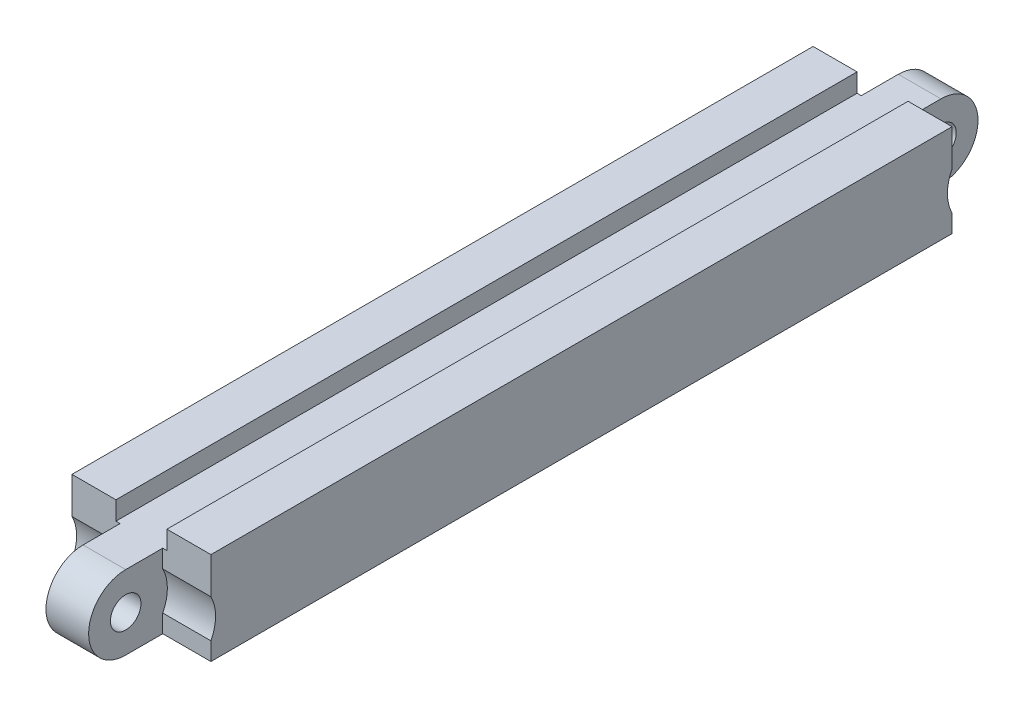
ISO-10303-21;
HEADER;
FILE_DESCRIPTION(('STEP AP214'),'2;1');
FILE_NAME('part.step','',(''),(''),'','','');
FILE_SCHEMA(('AUTOMOTIVE_DESIGN { 1 0 10303 214 1 1 1 1 }'));
ENDSEC;
DATA;
#1=APPLICATION_CONTEXT('core data for automotive mechanical design processes');
#2=APPLICATION_PROTOCOL_DEFINITION('international standard','automotive_design',2000,#1);
#3=PRODUCT_CONTEXT('',#1,'mechanical');
#4=PRODUCT('Part','Part','',(#3));
#5=PRODUCT_RELATED_PRODUCT_CATEGORY('part','',(#4));
#6=PRODUCT_DEFINITION_FORMATION('','',#4);
#7=PRODUCT_DEFINITION_CONTEXT('part definition',#1,'design');
#8=PRODUCT_DEFINITION('design','',#6,#7);
#9=PRODUCT_DEFINITION_SHAPE('','',#8);
#10=(LENGTH_UNIT() NAMED_UNIT(*) SI_UNIT(.MILLI.,.METRE.));
#11=(NAMED_UNIT(*) PLANE_ANGLE_UNIT() SI_UNIT($,.RADIAN.));
#12=(NAMED_UNIT(*) SI_UNIT($,.STERADIAN.) SOLID_ANGLE_UNIT());
#13=UNCERTAINTY_MEASURE_WITH_UNIT(LENGTH_MEASURE(1.E-05),#10,'distance_accuracy_value','');
#14=(GEOMETRIC_REPRESENTATION_CONTEXT(3) GLOBAL_UNCERTAINTY_ASSIGNED_CONTEXT((#13)) GLOBAL_UNIT_ASSIGNED_CONTEXT((#10,
#11,#12)) REPRESENTATION_CONTEXT('',''));
#15=CARTESIAN_POINT('',(0.,0.,0.));
#16=DIRECTION('',(0.,0.,1.));
#17=DIRECTION('',(1.,0.,0.));
#18=AXIS2_PLACEMENT_3D('',#15,#16,#17);
#19=CARTESIAN_POINT('',(7.5,0.,-40.));
#20=DIRECTION('',(0.,0.,-1.));
#21=DIRECTION('',(-1.,0.,0.));
#22=AXIS2_PLACEMENT_3D('',#19,#20,#21);
#23=PLANE('',#22);
#24=DIRECTION('',(0.,-1.,0.));
#25=VECTOR('',#24,1.);
#26=CARTESIAN_POINT('',(2.3,0.,-40.));
#27=LINE('',#26,#25);
#28=CARTESIAN_POINT('',(2.3,-2.06155281280881,-40.));
#29=VERTEX_POINT('',#28);
#30=CARTESIAN_POINT('',(2.3,-4.,-40.));
#31=VERTEX_POINT('',#30);
#32=EDGE_CURVE('E46',#29,#31,#27,.T.);
#33=ORIENTED_EDGE('',*,*,#32,.F.);
#34=DIRECTION('',(-1.,0.,0.));
#35=VECTOR('',#34,1.);
#36=CARTESIAN_POINT('',(7.5,-2.06155281280881,-40.));
#37=LINE('',#36,#35);
#38=CARTESIAN_POINT('',(7.5,-2.06155281280881,-40.));
#39=VERTEX_POINT('',#38);
#40=EDGE_CURVE('E353',#29,#39,#37,.F.);
#41=ORIENTED_EDGE('',*,*,#40,.T.);
#42=DIRECTION('',(0.,-1.,0.));
#43=VECTOR('',#42,1.);
#44=CARTESIAN_POINT('',(7.5,0.,-40.));
#45=LINE('',#44,#43);
#46=CARTESIAN_POINT('',(7.5,-4.,-40.));
#47=VERTEX_POINT('',#46);
#48=EDGE_CURVE('E61',#39,#47,#45,.T.);
#49=ORIENTED_EDGE('',*,*,#48,.T.);
#50=DIRECTION('',(-1.,0.,0.));
#51=VECTOR('',#50,1.);
#52=CARTESIAN_POINT('',(7.5,-4.,-40.));
#53=LINE('',#52,#51);
#54=EDGE_CURVE('E390',#47,#31,#53,.T.);
#55=ORIENTED_EDGE('',*,*,#54,.T.);
#56=EDGE_LOOP('',(#33,#41,#49,#55));
#57=FACE_BOUND('',#56,.T.);
#58=ADVANCED_FACE('F38',(#57),#23,.T.);
#59=CARTESIAN_POINT('',(7.5,6.,-40.));
#60=VERTEX_POINT('',#59);
#61=CARTESIAN_POINT('',(7.5,2.06155281280883,-40.));
#62=VERTEX_POINT('',#61);
#63=EDGE_CURVE('E385',#60,#62,#45,.T.);
#64=ORIENTED_EDGE('',*,*,#63,.T.);
#65=DIRECTION('',(-1.,0.,0.));
#66=VECTOR('',#65,1.);
#67=CARTESIAN_POINT('',(7.5,2.06155281280883,-40.));
#68=LINE('',#67,#66);
#69=CARTESIAN_POINT('',(2.3,2.06155281280883,-40.));
#70=VERTEX_POINT('',#69);
#71=EDGE_CURVE('E53',#62,#70,#68,.T.);
#72=ORIENTED_EDGE('',*,*,#71,.T.);
#73=CARTESIAN_POINT('',(2.3,4.,-40.));
#74=VERTEX_POINT('',#73);
#75=EDGE_CURVE('E11',#74,#70,#27,.T.);
#76=ORIENTED_EDGE('',*,*,#75,.F.);
#77=DIRECTION('',(-1.,0.,0.));
#78=VECTOR('',#77,1.);
#79=CARTESIAN_POINT('',(7.5,4.,-40.));
#80=LINE('',#79,#78);
#81=CARTESIAN_POINT('',(2.75,4.,-40.));
#82=VERTEX_POINT('',#81);
#83=EDGE_CURVE('E388',#82,#74,#80,.T.);
#84=ORIENTED_EDGE('',*,*,#83,.F.);
#85=DIRECTION('',(0.,-1.,0.));
#86=VECTOR('',#85,1.);
#87=CARTESIAN_POINT('',(2.75,0.,-40.));
#88=LINE('',#87,#86);
#89=CARTESIAN_POINT('',(2.75,6.,-40.));
#90=VERTEX_POINT('',#89);
#91=EDGE_CURVE('E369',#90,#82,#88,.T.);
#92=ORIENTED_EDGE('',*,*,#91,.F.);
#93=DIRECTION('',(-1.,0.,0.));
#94=VECTOR('',#93,1.);
#95=CARTESIAN_POINT('',(48.7310562561766,6.,-40.));
#96=LINE('',#95,#94);
#97=EDGE_CURVE('E378',#60,#90,#96,.T.);
#98=ORIENTED_EDGE('',*,*,#97,.F.);
#99=EDGE_LOOP('',(#64,#72,#76,#84,#92,#98));
#100=FACE_BOUND('',#99,.T.);
#101=ADVANCED_FACE('F415',(#100),#23,.T.);
#102=CARTESIAN_POINT('',(7.5,4.,0.));
#103=DIRECTION('',(0.,1.,0.));
#104=DIRECTION('',(0.,0.,1.));
#105=AXIS2_PLACEMENT_3D('',#102,#103,#104);
#106=PLANE('',#105);
#107=DIRECTION('',(-1.,0.,0.));
#108=VECTOR('',#107,1.);
#109=CARTESIAN_POINT('',(2.3,4.00000000000001,-44.));
#110=LINE('',#109,#108);
#111=CARTESIAN_POINT('',(2.3,4.00000000000001,-44.));
#112=VERTEX_POINT('',#111);
#113=CARTESIAN_POINT('',(-2.3,4.00000000000001,-44.));
#114=VERTEX_POINT('',#113);
#115=EDGE_CURVE('E365',#112,#114,#110,.T.);
#116=ORIENTED_EDGE('',*,*,#115,.T.);
#117=DIRECTION('',(0.,0.,1.));
#118=VECTOR('',#117,1.);
#119=CARTESIAN_POINT('',(-2.3,3.99999999999993,0.));
#120=LINE('',#119,#118);
#121=CARTESIAN_POINT('',(-2.3,4.,-40.));
#122=VERTEX_POINT('',#121);
#123=EDGE_CURVE('E318',#114,#122,#120,.T.);
#124=ORIENTED_EDGE('',*,*,#123,.T.);
#125=DIRECTION('',(1.,0.,0.));
#126=VECTOR('',#125,1.);
#127=CARTESIAN_POINT('',(-7.5,4.,-40.));
#128=LINE('',#127,#126);
#129=CARTESIAN_POINT('',(-2.75,4.,-40.));
#130=VERTEX_POINT('',#129);
#131=EDGE_CURVE('E337',#130,#122,#128,.T.);
#132=ORIENTED_EDGE('',*,*,#131,.F.);
#133=DIRECTION('',(0.,0.,-1.));
#134=VECTOR('',#133,1.);
#135=CARTESIAN_POINT('',(-2.75,4.,0.));
#136=LINE('',#135,#134);
#137=CARTESIAN_POINT('',(-2.75,4.,40.));
#138=VERTEX_POINT('',#137);
#139=EDGE_CURVE('E330',#138,#130,#136,.T.);
#140=ORIENTED_EDGE('',*,*,#139,.F.);
#141=DIRECTION('',(1.,0.,0.));
#142=VECTOR('',#141,1.);
#143=CARTESIAN_POINT('',(-7.5,4.,40.));
#144=LINE('',#143,#142);
#145=CARTESIAN_POINT('',(-2.3,4.,40.));
#146=VERTEX_POINT('',#145);
#147=EDGE_CURVE('E247',#138,#146,#144,.T.);
#148=ORIENTED_EDGE('',*,*,#147,.T.);
#149=DIRECTION('',(0.,0.,-1.));
#150=VECTOR('',#149,1.);
#151=CARTESIAN_POINT('',(-2.3,3.99999999999993,0.));
#152=LINE('',#151,#150);
#153=CARTESIAN_POINT('',(-2.3,4.00000000000001,44.));
#154=VERTEX_POINT('',#153);
#155=EDGE_CURVE('E239',#154,#146,#152,.T.);
#156=ORIENTED_EDGE('',*,*,#155,.F.);
#157=DIRECTION('',(-1.,0.,0.));
#158=VECTOR('',#157,1.);
#159=CARTESIAN_POINT('',(2.3,4.00000000000001,44.));
#160=LINE('',#159,#158);
#161=CARTESIAN_POINT('',(2.3,4.00000000000001,44.));
#162=VERTEX_POINT('',#161);
#163=EDGE_CURVE('E274',#162,#154,#160,.T.);
#164=ORIENTED_EDGE('',*,*,#163,.F.);
#165=DIRECTION('',(0.,0.,-1.));
#166=VECTOR('',#165,1.);
#167=CARTESIAN_POINT('',(2.3,3.99999999999993,0.));
#168=LINE('',#167,#166);
#169=CARTESIAN_POINT('',(2.3,4.,40.));
#170=VERTEX_POINT('',#169);
#171=EDGE_CURVE('E272',#162,#170,#168,.T.);
#172=ORIENTED_EDGE('',*,*,#171,.T.);
#173=DIRECTION('',(-1.,0.,0.));
#174=VECTOR('',#173,1.);
#175=CARTESIAN_POINT('',(7.5,4.,40.));
#176=LINE('',#175,#174);
#177=CARTESIAN_POINT('',(2.75,4.,40.));
#178=VERTEX_POINT('',#177);
#179=EDGE_CURVE('E290',#178,#170,#176,.T.);
#180=ORIENTED_EDGE('',*,*,#179,.F.);
#181=DIRECTION('',(0.,0.,-1.));
#182=VECTOR('',#181,1.);
#183=CARTESIAN_POINT('',(2.75,4.,0.));
#184=LINE('',#183,#182);
#185=EDGE_CURVE('E380',#178,#82,#184,.T.);
#186=ORIENTED_EDGE('',*,*,#185,.T.);
#187=ORIENTED_EDGE('',*,*,#83,.T.);
#188=DIRECTION('',(0.,0.,1.));
#189=VECTOR('',#188,1.);
#190=CARTESIAN_POINT('',(2.3,3.99999999999993,0.));
#191=LINE('',#190,#189);
#192=EDGE_CURVE('E363',#112,#74,#191,.T.);
#193=ORIENTED_EDGE('',*,*,#192,.F.);
#194=EDGE_LOOP('',(#116,#124,#132,#140,#148,#156,#164,#172,#180,#186,#187,#193));
#195=FACE_BOUND('',#194,.T.);
#196=ADVANCED_FACE('F417',(#195),#106,.T.);
#197=CARTESIAN_POINT('',(7.5,-4.,0.));
#198=DIRECTION('',(0.,-1.,0.));
#199=DIRECTION('',(0.,0.,-1.));
#200=AXIS2_PLACEMENT_3D('',#197,#198,#199);
#201=PLANE('',#200);
#202=DIRECTION('',(0.,0.,1.));
#203=VECTOR('',#202,1.);
#204=CARTESIAN_POINT('',(7.5,-4.,0.));
#205=LINE('',#204,#203);
#206=CARTESIAN_POINT('',(7.5,-4.,40.));
#207=VERTEX_POINT('',#206);
#208=EDGE_CURVE('E383',#47,#207,#205,.T.);
#209=ORIENTED_EDGE('',*,*,#208,.T.);
#210=DIRECTION('',(-1.,0.,0.));
#211=VECTOR('',#210,1.);
#212=CARTESIAN_POINT('',(7.5,-4.,40.));
#213=LINE('',#212,#211);
#214=CARTESIAN_POINT('',(2.3,-4.,40.));
#215=VERTEX_POINT('',#214);
#216=EDGE_CURVE('E293',#207,#215,#213,.T.);
#217=ORIENTED_EDGE('',*,*,#216,.T.);
#218=DIRECTION('',(0.,0.,-1.));
#219=VECTOR('',#218,1.);
#220=CARTESIAN_POINT('',(2.3,-4.00000000000007,0.));
#221=LINE('',#220,#219);
#222=CARTESIAN_POINT('',(2.3,-3.99999999999999,44.));
#223=VERTEX_POINT('',#222);
#224=EDGE_CURVE('E268',#223,#215,#221,.T.);
#225=ORIENTED_EDGE('',*,*,#224,.F.);
#226=DIRECTION('',(-1.,0.,0.));
#227=VECTOR('',#226,1.);
#228=CARTESIAN_POINT('',(2.3,-3.99999999999999,44.));
#229=LINE('',#228,#227);
#230=CARTESIAN_POINT('',(-2.3,-3.99999999999999,44.));
#231=VERTEX_POINT('',#230);
#232=EDGE_CURVE('E277',#223,#231,#229,.T.);
#233=ORIENTED_EDGE('',*,*,#232,.T.);
#234=DIRECTION('',(0.,0.,-1.));
#235=VECTOR('',#234,1.);
#236=CARTESIAN_POINT('',(-2.3,-4.00000000000007,0.));
#237=LINE('',#236,#235);
#238=CARTESIAN_POINT('',(-2.3,-4.,40.));
#239=VERTEX_POINT('',#238);
#240=EDGE_CURVE('E230',#231,#239,#237,.T.);
#241=ORIENTED_EDGE('',*,*,#240,.T.);
#242=DIRECTION('',(1.,0.,0.));
#243=VECTOR('',#242,1.);
#244=CARTESIAN_POINT('',(-7.5,-4.,40.));
#245=LINE('',#244,#243);
#246=CARTESIAN_POINT('',(-7.5,-4.,40.));
#247=VERTEX_POINT('',#246);
#248=EDGE_CURVE('E250',#247,#239,#245,.T.);
#249=ORIENTED_EDGE('',*,*,#248,.F.);
#250=DIRECTION('',(0.,0.,1.));
#251=VECTOR('',#250,1.);
#252=CARTESIAN_POINT('',(-7.5,-4.,0.));
#253=LINE('',#252,#251);
#254=CARTESIAN_POINT('',(-7.5,-4.,-40.));
#255=VERTEX_POINT('',#254);
#256=EDGE_CURVE('E218',#255,#247,#253,.T.);
#257=ORIENTED_EDGE('',*,*,#256,.F.);
#258=DIRECTION('',(1.,0.,0.));
#259=VECTOR('',#258,1.);
#260=CARTESIAN_POINT('',(-7.5,-4.,-40.));
#261=LINE('',#260,#259);
#262=CARTESIAN_POINT('',(-2.3,-4.,-40.));
#263=VERTEX_POINT('',#262);
#264=EDGE_CURVE('E340',#255,#263,#261,.T.);
#265=ORIENTED_EDGE('',*,*,#264,.T.);
#266=DIRECTION('',(0.,0.,1.));
#267=VECTOR('',#266,1.);
#268=CARTESIAN_POINT('',(-2.3,-4.00000000000007,0.));
#269=LINE('',#268,#267);
#270=CARTESIAN_POINT('',(-2.3,-3.99999999999999,-44.));
#271=VERTEX_POINT('',#270);
#272=EDGE_CURVE('E313',#271,#263,#269,.T.);
#273=ORIENTED_EDGE('',*,*,#272,.F.);
#274=DIRECTION('',(-1.,0.,0.));
#275=VECTOR('',#274,1.);
#276=CARTESIAN_POINT('',(2.3,-3.99999999999999,-44.));
#277=LINE('',#276,#275);
#278=CARTESIAN_POINT('',(2.3,-3.99999999999999,-44.));
#279=VERTEX_POINT('',#278);
#280=EDGE_CURVE('E367',#279,#271,#277,.T.);
#281=ORIENTED_EDGE('',*,*,#280,.F.);
#282=DIRECTION('',(0.,0.,1.));
#283=VECTOR('',#282,1.);
#284=CARTESIAN_POINT('',(2.3,-4.00000000000007,0.));
#285=LINE('',#284,#283);
#286=EDGE_CURVE('E358',#279,#31,#285,.T.);
#287=ORIENTED_EDGE('',*,*,#286,.T.);
#288=ORIENTED_EDGE('',*,*,#54,.F.);
#289=EDGE_LOOP('',(#209,#217,#225,#233,#241,#249,#257,#265,#273,#281,#287,#288));
#290=FACE_BOUND('',#289,.T.);
#291=ADVANCED_FACE('F40',(#290),#201,.T.);
#292=CARTESIAN_POINT('',(7.5,0.,0.));
#293=DIRECTION('',(1.,0.,0.));
#294=DIRECTION('',(0.,0.,-1.));
#295=AXIS2_PLACEMENT_3D('',#292,#293,#294);
#296=PLANE('',#295);
#297=ORIENTED_EDGE('',*,*,#48,.F.);
#298=CARTESIAN_POINT('',(7.5,0.,-44.));
#299=DIRECTION('',(1.,0.,0.));
#300=DIRECTION('',(0.,0.,-1.));
#301=AXIS2_PLACEMENT_3D('',#298,#299,#300);
#302=CIRCLE('',#301,4.5);
#303=EDGE_CURVE('E348',#62,#39,#302,.T.);
#304=ORIENTED_EDGE('',*,*,#303,.F.);
#305=ORIENTED_EDGE('',*,*,#63,.F.);
#306=DIRECTION('',(0.,0.,-1.));
#307=VECTOR('',#306,1.);
#308=CARTESIAN_POINT('',(7.5,6.,0.));
#309=LINE('',#308,#307);
#310=CARTESIAN_POINT('',(7.5,6.,40.));
#311=VERTEX_POINT('',#310);
#312=EDGE_CURVE('E373',#311,#60,#309,.T.);
#313=ORIENTED_EDGE('',*,*,#312,.F.);
#314=DIRECTION('',(0.,-1.,0.));
#315=VECTOR('',#314,1.);
#316=CARTESIAN_POINT('',(7.5,0.,40.));
#317=LINE('',#316,#315);
#318=CARTESIAN_POINT('',(7.5,2.06155281280883,40.));
#319=VERTEX_POINT('',#318);
#320=EDGE_CURVE('E287',#311,#319,#317,.T.);
#321=ORIENTED_EDGE('',*,*,#320,.T.);
#322=CARTESIAN_POINT('',(7.5,0.,44.));
#323=DIRECTION('',(-1.,0.,0.));
#324=DIRECTION('',(0.,0.,1.));
#325=AXIS2_PLACEMENT_3D('',#322,#323,#324);
#326=CIRCLE('',#325,4.5);
#327=CARTESIAN_POINT('',(7.5,-2.06155281280881,40.));
#328=VERTEX_POINT('',#327);
#329=EDGE_CURVE('E256',#319,#328,#326,.T.);
#330=ORIENTED_EDGE('',*,*,#329,.T.);
#331=EDGE_CURVE('E286',#328,#207,#317,.T.);
#332=ORIENTED_EDGE('',*,*,#331,.T.);
#333=ORIENTED_EDGE('',*,*,#208,.F.);
#334=EDGE_LOOP('',(#297,#304,#305,#313,#321,#330,#332,#333));
#335=FACE_BOUND('',#334,.T.);
#336=ADVANCED_FACE('F399',(#335),#296,.T.);
#337=CARTESIAN_POINT('',(2.75,0.,0.));
#338=DIRECTION('',(1.,0.,0.));
#339=DIRECTION('',(0.,0.,-1.));
#340=AXIS2_PLACEMENT_3D('',#337,#338,#339);
#341=PLANE('',#340);
#342=ORIENTED_EDGE('',*,*,#185,.F.);
#343=DIRECTION('',(0.,-1.,0.));
#344=VECTOR('',#343,1.);
#345=CARTESIAN_POINT('',(2.75,0.,40.));
#346=LINE('',#345,#344);
#347=CARTESIAN_POINT('',(2.75,6.,40.));
#348=VERTEX_POINT('',#347);
#349=EDGE_CURVE('E280',#348,#178,#346,.T.);
#350=ORIENTED_EDGE('',*,*,#349,.F.);
#351=DIRECTION('',(0.,0.,-1.));
#352=VECTOR('',#351,1.);
#353=CARTESIAN_POINT('',(2.75,6.,0.));
#354=LINE('',#353,#352);
#355=EDGE_CURVE('E370',#348,#90,#354,.T.);
#356=ORIENTED_EDGE('',*,*,#355,.T.);
#357=ORIENTED_EDGE('',*,*,#91,.T.);
#358=EDGE_LOOP('',(#342,#350,#356,#357));
#359=FACE_BOUND('',#358,.T.);
#360=ADVANCED_FACE('F421',(#359),#341,.F.);
#361=CARTESIAN_POINT('',(48.7310562561766,6.,0.));
#362=DIRECTION('',(0.,1.,0.));
#363=DIRECTION('',(0.,0.,1.));
#364=AXIS2_PLACEMENT_3D('',#361,#362,#363);
#365=PLANE('',#364);
#366=ORIENTED_EDGE('',*,*,#355,.F.);
#367=DIRECTION('',(-1.,0.,0.));
#368=VECTOR('',#367,1.);
#369=CARTESIAN_POINT('',(48.7310562561766,6.,40.));
#370=LINE('',#369,#368);
#371=EDGE_CURVE('E283',#311,#348,#370,.T.);
#372=ORIENTED_EDGE('',*,*,#371,.F.);
#373=ORIENTED_EDGE('',*,*,#312,.T.);
#374=ORIENTED_EDGE('',*,*,#97,.T.);
#375=EDGE_LOOP('',(#366,#372,#373,#374));
#376=FACE_BOUND('',#375,.T.);
#377=ADVANCED_FACE('F425',(#376),#365,.T.);
#378=CARTESIAN_POINT('',(2.3,0.,-44.));
#379=DIRECTION('',(-1.,0.,0.));
#380=DIRECTION('',(0.,0.,1.));
#381=AXIS2_PLACEMENT_3D('',#378,#379,#380);
#382=CYLINDRICAL_SURFACE('',#381,4.);
#383=ORIENTED_EDGE('',*,*,#280,.T.);
#384=CARTESIAN_POINT('',(-2.3,0.,-44.));
#385=DIRECTION('',(1.,0.,0.));
#386=DIRECTION('',(0.,0.,-1.));
#387=AXIS2_PLACEMENT_3D('',#384,#385,#386);
#388=CIRCLE('',#387,4.);
#389=EDGE_CURVE('E315',#271,#114,#388,.T.);
#390=ORIENTED_EDGE('',*,*,#389,.T.);
#391=ORIENTED_EDGE('',*,*,#115,.F.);
#392=CARTESIAN_POINT('',(2.3,0.,-44.));
#393=DIRECTION('',(1.,0.,0.));
#394=DIRECTION('',(0.,0.,-1.));
#395=AXIS2_PLACEMENT_3D('',#392,#393,#394);
#396=CIRCLE('',#395,4.);
#397=EDGE_CURVE('E360',#279,#112,#396,.T.);
#398=ORIENTED_EDGE('',*,*,#397,.F.);
#399=EDGE_LOOP('',(#383,#390,#391,#398));
#400=FACE_BOUND('',#399,.T.);
#401=ADVANCED_FACE('F411',(#400),#382,.T.);
#402=CARTESIAN_POINT('',(2.3,0.,-44.));
#403=DIRECTION('',(-1.,0.,0.));
#404=DIRECTION('',(0.,0.,1.));
#405=AXIS2_PLACEMENT_3D('',#402,#403,#404);
#406=CYLINDRICAL_SURFACE('',#405,1.65);
#407=CARTESIAN_POINT('',(2.3,0.,-44.));
#408=DIRECTION('',(1.,0.,0.));
#409=DIRECTION('',(0.,0.,-1.));
#410=AXIS2_PLACEMENT_3D('',#407,#408,#409);
#411=CIRCLE('',#410,1.65);
#412=CARTESIAN_POINT('',(2.3,0.,-45.65));
#413=VERTEX_POINT('',#412);
#414=EDGE_CURVE('E355',#413,#413,#411,.T.);
#415=ORIENTED_EDGE('',*,*,#414,.T.);
#416=EDGE_LOOP('',(#415));
#417=FACE_BOUND('',#416,.T.);
#418=CARTESIAN_POINT('',(-2.3,0.,-44.));
#419=DIRECTION('',(1.,0.,0.));
#420=DIRECTION('',(0.,0.,-1.));
#421=AXIS2_PLACEMENT_3D('',#418,#419,#420);
#422=CIRCLE('',#421,1.65);
#423=CARTESIAN_POINT('',(-2.3,0.,-45.65));
#424=VERTEX_POINT('',#423);
#425=EDGE_CURVE('E310',#424,#424,#422,.T.);
#426=ORIENTED_EDGE('',*,*,#425,.F.);
#427=EDGE_LOOP('',(#426));
#428=FACE_BOUND('',#427,.T.);
#429=ADVANCED_FACE('F501',(#417,#428),#406,.F.);
#430=CARTESIAN_POINT('',(2.3,0.,0.));
#431=DIRECTION('',(1.,0.,0.));
#432=DIRECTION('',(0.,0.,-1.));
#433=AXIS2_PLACEMENT_3D('',#430,#431,#432);
#434=PLANE('',#433);
#435=ORIENTED_EDGE('',*,*,#75,.T.);
#436=CARTESIAN_POINT('',(2.3,0.,-44.));
#437=DIRECTION('',(1.,0.,0.));
#438=DIRECTION('',(0.,0.,-1.));
#439=AXIS2_PLACEMENT_3D('',#436,#437,#438);
#440=CIRCLE('',#439,4.5);
#441=EDGE_CURVE('E347',#70,#29,#440,.T.);
#442=ORIENTED_EDGE('',*,*,#441,.T.);
#443=ORIENTED_EDGE('',*,*,#32,.T.);
#444=ORIENTED_EDGE('',*,*,#286,.F.);
#445=ORIENTED_EDGE('',*,*,#397,.T.);
#446=ORIENTED_EDGE('',*,*,#192,.T.);
#447=EDGE_LOOP('',(#435,#442,#443,#444,#445,#446));
#448=FACE_BOUND('',#447,.T.);
#449=ORIENTED_EDGE('',*,*,#414,.F.);
#450=EDGE_LOOP('',(#449));
#451=FACE_BOUND('',#450,.T.);
#452=ADVANCED_FACE('F395',(#448,#451),#434,.T.);
#453=CARTESIAN_POINT('',(7.5,0.,-44.));
#454=DIRECTION('',(-1.,0.,0.));
#455=DIRECTION('',(0.,0.,1.));
#456=AXIS2_PLACEMENT_3D('',#453,#454,#455);
#457=CYLINDRICAL_SURFACE('',#456,4.5);
#458=ORIENTED_EDGE('',*,*,#441,.F.);
#459=ORIENTED_EDGE('',*,*,#71,.F.);
#460=ORIENTED_EDGE('',*,*,#303,.T.);
#461=ORIENTED_EDGE('',*,*,#40,.F.);
#462=EDGE_LOOP('',(#458,#459,#460,#461));
#463=FACE_BOUND('',#462,.T.);
#464=ADVANCED_FACE('F509',(#463),#457,.F.);
#465=CARTESIAN_POINT('',(-7.5,0.,-40.));
#466=DIRECTION('',(0.,0.,-1.));
#467=DIRECTION('',(1.,0.,0.));
#468=AXIS2_PLACEMENT_3D('',#465,#466,#467);
#469=PLANE('',#468);
#470=DIRECTION('',(0.,-1.,0.));
#471=VECTOR('',#470,1.);
#472=CARTESIAN_POINT('',(-2.3,0.,-40.));
#473=LINE('',#472,#471);
#474=CARTESIAN_POINT('',(-2.3,-2.06155281280881,-40.));
#475=VERTEX_POINT('',#474);
#476=EDGE_CURVE('E343',#475,#263,#473,.T.);
#477=ORIENTED_EDGE('',*,*,#476,.T.);
#478=ORIENTED_EDGE('',*,*,#264,.F.);
#479=DIRECTION('',(0.,-1.,0.));
#480=VECTOR('',#479,1.);
#481=CARTESIAN_POINT('',(-7.5,0.,-40.));
#482=LINE('',#481,#480);
#483=CARTESIAN_POINT('',(-7.5,-2.06155281280881,-40.));
#484=VERTEX_POINT('',#483);
#485=EDGE_CURVE('E333',#484,#255,#482,.T.);
#486=ORIENTED_EDGE('',*,*,#485,.F.);
#487=DIRECTION('',(1.,0.,0.));
#488=VECTOR('',#487,1.);
#489=CARTESIAN_POINT('',(-7.5,-2.06155281280881,-40.));
#490=LINE('',#489,#488);
#491=EDGE_CURVE('E307',#475,#484,#490,.F.);
#492=ORIENTED_EDGE('',*,*,#491,.F.);
#493=EDGE_LOOP('',(#477,#478,#486,#492));
#494=FACE_BOUND('',#493,.T.);
#495=ADVANCED_FACE('F455',(#494),#469,.T.);
#496=CARTESIAN_POINT('',(-7.5,6.,-40.));
#497=VERTEX_POINT('',#496);
#498=CARTESIAN_POINT('',(-7.5,2.06155281280883,-40.));
#499=VERTEX_POINT('',#498);
#500=EDGE_CURVE('E334',#497,#499,#482,.T.);
#501=ORIENTED_EDGE('',*,*,#500,.F.);
#502=DIRECTION('',(1.,0.,0.));
#503=VECTOR('',#502,1.);
#504=CARTESIAN_POINT('',(-48.7310562561766,6.,-40.));
#505=LINE('',#504,#503);
#506=CARTESIAN_POINT('',(-2.75,6.,-40.));
#507=VERTEX_POINT('',#506);
#508=EDGE_CURVE('E327',#497,#507,#505,.T.);
#509=ORIENTED_EDGE('',*,*,#508,.T.);
#510=DIRECTION('',(0.,-1.,0.));
#511=VECTOR('',#510,1.);
#512=CARTESIAN_POINT('',(-2.75,0.,-40.));
#513=LINE('',#512,#511);
#514=EDGE_CURVE('E320',#507,#130,#513,.T.);
#515=ORIENTED_EDGE('',*,*,#514,.T.);
#516=ORIENTED_EDGE('',*,*,#131,.T.);
#517=CARTESIAN_POINT('',(-2.3,2.06155281280883,-40.));
#518=VERTEX_POINT('',#517);
#519=EDGE_CURVE('E344',#122,#518,#473,.T.);
#520=ORIENTED_EDGE('',*,*,#519,.T.);
#521=DIRECTION('',(1.,0.,0.));
#522=VECTOR('',#521,1.);
#523=CARTESIAN_POINT('',(-7.5,2.06155281280883,-40.));
#524=LINE('',#523,#522);
#525=EDGE_CURVE('E303',#499,#518,#524,.T.);
#526=ORIENTED_EDGE('',*,*,#525,.F.);
#527=EDGE_LOOP('',(#501,#509,#515,#516,#520,#526));
#528=FACE_BOUND('',#527,.T.);
#529=ADVANCED_FACE('F466',(#528),#469,.T.);
#530=CARTESIAN_POINT('',(-7.5,0.,0.));
#531=DIRECTION('',(-1.,0.,0.));
#532=DIRECTION('',(0.,0.,-1.));
#533=AXIS2_PLACEMENT_3D('',#530,#531,#532);
#534=PLANE('',#533);
#535=ORIENTED_EDGE('',*,*,#485,.T.);
#536=ORIENTED_EDGE('',*,*,#256,.T.);
#537=DIRECTION('',(0.,-1.,0.));
#538=VECTOR('',#537,1.);
#539=CARTESIAN_POINT('',(-7.5,0.,40.));
#540=LINE('',#539,#538);
#541=CARTESIAN_POINT('',(-7.5,-2.06155281280881,40.));
#542=VERTEX_POINT('',#541);
#543=EDGE_CURVE('E215',#542,#247,#540,.T.);
#544=ORIENTED_EDGE('',*,*,#543,.F.);
#545=CARTESIAN_POINT('',(-7.5,0.,44.));
#546=DIRECTION('',(-1.,0.,0.));
#547=DIRECTION('',(0.,0.,1.));
#548=AXIS2_PLACEMENT_3D('',#545,#546,#547);
#549=CIRCLE('',#548,4.5);
#550=CARTESIAN_POINT('',(-7.5,2.06155281280883,40.));
#551=VERTEX_POINT('',#550);
#552=EDGE_CURVE('E201',#551,#542,#549,.T.);
#553=ORIENTED_EDGE('',*,*,#552,.F.);
#554=CARTESIAN_POINT('',(-7.5,6.,40.));
#555=VERTEX_POINT('',#554);
#556=EDGE_CURVE('E222',#555,#551,#540,.T.);
#557=ORIENTED_EDGE('',*,*,#556,.F.);
#558=DIRECTION('',(0.,0.,-1.));
#559=VECTOR('',#558,1.);
#560=CARTESIAN_POINT('',(-7.5,6.,0.));
#561=LINE('',#560,#559);
#562=EDGE_CURVE('E323',#555,#497,#561,.T.);
#563=ORIENTED_EDGE('',*,*,#562,.T.);
#564=ORIENTED_EDGE('',*,*,#500,.T.);
#565=CARTESIAN_POINT('',(-7.5,0.,-44.));
#566=DIRECTION('',(1.,0.,0.));
#567=DIRECTION('',(0.,0.,-1.));
#568=AXIS2_PLACEMENT_3D('',#565,#566,#567);
#569=CIRCLE('',#568,4.5);
#570=EDGE_CURVE('E301',#499,#484,#569,.T.);
#571=ORIENTED_EDGE('',*,*,#570,.T.);
#572=EDGE_LOOP('',(#535,#536,#544,#553,#557,#563,#564,#571));
#573=FACE_BOUND('',#572,.T.);
#574=ADVANCED_FACE('F217',(#573),#534,.T.);
#575=CARTESIAN_POINT('',(-2.75,0.,0.));
#576=DIRECTION('',(-1.,0.,0.));
#577=DIRECTION('',(0.,0.,-1.));
#578=AXIS2_PLACEMENT_3D('',#575,#576,#577);
#579=PLANE('',#578);
#580=ORIENTED_EDGE('',*,*,#139,.T.);
#581=ORIENTED_EDGE('',*,*,#514,.F.);
#582=DIRECTION('',(0.,0.,-1.));
#583=VECTOR('',#582,1.);
#584=CARTESIAN_POINT('',(-2.75,6.,0.));
#585=LINE('',#584,#583);
#586=CARTESIAN_POINT('',(-2.75,6.,40.));
#587=VERTEX_POINT('',#586);
#588=EDGE_CURVE('E321',#587,#507,#585,.T.);
#589=ORIENTED_EDGE('',*,*,#588,.F.);
#590=DIRECTION('',(0.,-1.,0.));
#591=VECTOR('',#590,1.);
#592=CARTESIAN_POINT('',(-2.75,0.,40.));
#593=LINE('',#592,#591);
#594=EDGE_CURVE('E242',#587,#138,#593,.T.);
#595=ORIENTED_EDGE('',*,*,#594,.T.);
#596=EDGE_LOOP('',(#580,#581,#589,#595));
#597=FACE_BOUND('',#596,.T.);
#598=ADVANCED_FACE('F469',(#597),#579,.F.);
#599=CARTESIAN_POINT('',(-48.7310562561766,6.,0.));
#600=DIRECTION('',(0.,1.,0.));
#601=DIRECTION('',(0.,0.,1.));
#602=AXIS2_PLACEMENT_3D('',#599,#600,#601);
#603=PLANE('',#602);
#604=ORIENTED_EDGE('',*,*,#562,.F.);
#605=DIRECTION('',(1.,0.,0.));
#606=VECTOR('',#605,1.);
#607=CARTESIAN_POINT('',(-48.7310562561766,6.,40.));
#608=LINE('',#607,#606);
#609=EDGE_CURVE('E223',#555,#587,#608,.T.);
#610=ORIENTED_EDGE('',*,*,#609,.T.);
#611=ORIENTED_EDGE('',*,*,#588,.T.);
#612=ORIENTED_EDGE('',*,*,#508,.F.);
#613=EDGE_LOOP('',(#604,#610,#611,#612));
#614=FACE_BOUND('',#613,.T.);
#615=ADVANCED_FACE('F476',(#614),#603,.T.);
#616=CARTESIAN_POINT('',(-2.3,0.,0.));
#617=DIRECTION('',(-1.,0.,0.));
#618=DIRECTION('',(0.,0.,-1.));
#619=AXIS2_PLACEMENT_3D('',#616,#617,#618);
#620=PLANE('',#619);
#621=ORIENTED_EDGE('',*,*,#519,.F.);
#622=ORIENTED_EDGE('',*,*,#123,.F.);
#623=ORIENTED_EDGE('',*,*,#389,.F.);
#624=ORIENTED_EDGE('',*,*,#272,.T.);
#625=ORIENTED_EDGE('',*,*,#476,.F.);
#626=CARTESIAN_POINT('',(-2.3,0.,-44.));
#627=DIRECTION('',(1.,0.,0.));
#628=DIRECTION('',(0.,0.,-1.));
#629=AXIS2_PLACEMENT_3D('',#626,#627,#628);
#630=CIRCLE('',#629,4.5);
#631=EDGE_CURVE('E300',#518,#475,#630,.T.);
#632=ORIENTED_EDGE('',*,*,#631,.F.);
#633=EDGE_LOOP('',(#621,#622,#623,#624,#625,#632));
#634=FACE_BOUND('',#633,.T.);
#635=ORIENTED_EDGE('',*,*,#425,.T.);
#636=EDGE_LOOP('',(#635));
#637=FACE_BOUND('',#636,.T.);
#638=ADVANCED_FACE('F459',(#634,#637),#620,.T.);
#639=CARTESIAN_POINT('',(-7.5,0.,-44.));
#640=DIRECTION('',(1.,0.,0.));
#641=DIRECTION('',(0.,0.,1.));
#642=AXIS2_PLACEMENT_3D('',#639,#640,#641);
#643=CYLINDRICAL_SURFACE('',#642,4.5);
#644=ORIENTED_EDGE('',*,*,#631,.T.);
#645=ORIENTED_EDGE('',*,*,#491,.T.);
#646=ORIENTED_EDGE('',*,*,#570,.F.);
#647=ORIENTED_EDGE('',*,*,#525,.T.);
#648=EDGE_LOOP('',(#644,#645,#646,#647));
#649=FACE_BOUND('',#648,.T.);
#650=ADVANCED_FACE('F479',(#649),#643,.F.);
#651=CARTESIAN_POINT('',(7.5,0.,40.));
#652=DIRECTION('',(0.,0.,1.));
#653=DIRECTION('',(-1.,0.,0.));
#654=AXIS2_PLACEMENT_3D('',#651,#652,#653);
#655=PLANE('',#654);
#656=DIRECTION('',(0.,-1.,0.));
#657=VECTOR('',#656,1.);
#658=CARTESIAN_POINT('',(2.3,0.,40.));
#659=LINE('',#658,#657);
#660=CARTESIAN_POINT('',(2.3,-2.06155281280881,40.));
#661=VERTEX_POINT('',#660);
#662=EDGE_CURVE('E296',#661,#215,#659,.T.);
#663=ORIENTED_EDGE('',*,*,#662,.T.);
#664=ORIENTED_EDGE('',*,*,#216,.F.);
#665=ORIENTED_EDGE('',*,*,#331,.F.);
#666=DIRECTION('',(-1.,0.,0.));
#667=VECTOR('',#666,1.);
#668=CARTESIAN_POINT('',(7.5,-2.06155281280881,40.));
#669=LINE('',#668,#667);
#670=EDGE_CURVE('E262',#661,#328,#669,.F.);
#671=ORIENTED_EDGE('',*,*,#670,.F.);
#672=EDGE_LOOP('',(#663,#664,#665,#671));
#673=FACE_BOUND('',#672,.T.);
#674=ADVANCED_FACE('F436',(#673),#655,.T.);
#675=ORIENTED_EDGE('',*,*,#320,.F.);
#676=ORIENTED_EDGE('',*,*,#371,.T.);
#677=ORIENTED_EDGE('',*,*,#349,.T.);
#678=ORIENTED_EDGE('',*,*,#179,.T.);
#679=CARTESIAN_POINT('',(2.3,2.06155281280883,40.));
#680=VERTEX_POINT('',#679);
#681=EDGE_CURVE('E297',#170,#680,#659,.T.);
#682=ORIENTED_EDGE('',*,*,#681,.T.);
#683=DIRECTION('',(-1.,0.,0.));
#684=VECTOR('',#683,1.);
#685=CARTESIAN_POINT('',(7.5,2.06155281280883,40.));
#686=LINE('',#685,#684);
#687=EDGE_CURVE('E258',#319,#680,#686,.T.);
#688=ORIENTED_EDGE('',*,*,#687,.F.);
#689=EDGE_LOOP('',(#675,#676,#677,#678,#682,#688));
#690=FACE_BOUND('',#689,.T.);
#691=ADVANCED_FACE('F429',(#690),#655,.T.);
#692=CARTESIAN_POINT('',(2.3,0.,44.));
#693=DIRECTION('',(-1.,0.,0.));
#694=DIRECTION('',(0.,0.,-1.));
#695=AXIS2_PLACEMENT_3D('',#692,#693,#694);
#696=CYLINDRICAL_SURFACE('',#695,4.);
#697=ORIENTED_EDGE('',*,*,#232,.F.);
#698=CARTESIAN_POINT('',(2.3,0.,44.));
#699=DIRECTION('',(-1.,0.,0.));
#700=DIRECTION('',(0.,0.,1.));
#701=AXIS2_PLACEMENT_3D('',#698,#699,#700);
#702=CIRCLE('',#701,4.);
#703=EDGE_CURVE('E270',#223,#162,#702,.T.);
#704=ORIENTED_EDGE('',*,*,#703,.T.);
#705=ORIENTED_EDGE('',*,*,#163,.T.);
#706=CARTESIAN_POINT('',(-2.3,0.,44.));
#707=DIRECTION('',(-1.,0.,0.));
#708=DIRECTION('',(0.,0.,1.));
#709=AXIS2_PLACEMENT_3D('',#706,#707,#708);
#710=CIRCLE('',#709,4.);
#711=EDGE_CURVE('E237',#231,#154,#710,.T.);
#712=ORIENTED_EDGE('',*,*,#711,.F.);
#713=EDGE_LOOP('',(#697,#704,#705,#712));
#714=FACE_BOUND('',#713,.T.);
#715=ADVANCED_FACE('F444',(#714),#696,.T.);
#716=CARTESIAN_POINT('',(2.3,0.,44.));
#717=DIRECTION('',(-1.,0.,0.));
#718=DIRECTION('',(0.,0.,-1.));
#719=AXIS2_PLACEMENT_3D('',#716,#717,#718);
#720=CYLINDRICAL_SURFACE('',#719,1.65);
#721=CARTESIAN_POINT('',(2.3,0.,44.));
#722=DIRECTION('',(-1.,0.,0.));
#723=DIRECTION('',(0.,0.,1.));
#724=AXIS2_PLACEMENT_3D('',#721,#722,#723);
#725=CIRCLE('',#724,1.65);
#726=CARTESIAN_POINT('',(2.3,0.,45.65));
#727=VERTEX_POINT('',#726);
#728=EDGE_CURVE('E265',#727,#727,#725,.T.);
#729=ORIENTED_EDGE('',*,*,#728,.F.);
#730=EDGE_LOOP('',(#729));
#731=FACE_BOUND('',#730,.T.);
#732=CARTESIAN_POINT('',(-2.3,0.,44.));
#733=DIRECTION('',(-1.,0.,0.));
#734=DIRECTION('',(0.,0.,1.));
#735=AXIS2_PLACEMENT_3D('',#732,#733,#734);
#736=CIRCLE('',#735,1.65);
#737=CARTESIAN_POINT('',(-2.3,0.,45.65));
#738=VERTEX_POINT('',#737);
#739=EDGE_CURVE('E227',#738,#738,#736,.T.);
#740=ORIENTED_EDGE('',*,*,#739,.T.);
#741=EDGE_LOOP('',(#740));
#742=FACE_BOUND('',#741,.T.);
#743=ADVANCED_FACE('F845',(#731,#742),#720,.F.);
#744=CARTESIAN_POINT('',(2.3,0.,0.));
#745=DIRECTION('',(1.,0.,0.));
#746=DIRECTION('',(0.,0.,1.));
#747=AXIS2_PLACEMENT_3D('',#744,#745,#746);
#748=PLANE('',#747);
#749=ORIENTED_EDGE('',*,*,#681,.F.);
#750=ORIENTED_EDGE('',*,*,#171,.F.);
#751=ORIENTED_EDGE('',*,*,#703,.F.);
#752=ORIENTED_EDGE('',*,*,#224,.T.);
#753=ORIENTED_EDGE('',*,*,#662,.F.);
#754=CARTESIAN_POINT('',(2.3,0.,44.));
#755=DIRECTION('',(-1.,0.,0.));
#756=DIRECTION('',(0.,0.,1.));
#757=AXIS2_PLACEMENT_3D('',#754,#755,#756);
#758=CIRCLE('',#757,4.5);
#759=EDGE_CURVE('E255',#680,#661,#758,.T.);
#760=ORIENTED_EDGE('',*,*,#759,.F.);
#761=EDGE_LOOP('',(#749,#750,#751,#752,#753,#760));
#762=FACE_BOUND('',#761,.T.);
#763=ORIENTED_EDGE('',*,*,#728,.T.);
#764=EDGE_LOOP('',(#763));
#765=FACE_BOUND('',#764,.T.);
#766=ADVANCED_FACE('F438',(#762,#765),#748,.T.);
#767=CARTESIAN_POINT('',(7.5,0.,44.));
#768=DIRECTION('',(-1.,0.,0.));
#769=DIRECTION('',(0.,0.,-1.));
#770=AXIS2_PLACEMENT_3D('',#767,#768,#769);
#771=CYLINDRICAL_SURFACE('',#770,4.5);
#772=ORIENTED_EDGE('',*,*,#759,.T.);
#773=ORIENTED_EDGE('',*,*,#670,.T.);
#774=ORIENTED_EDGE('',*,*,#329,.F.);
#775=ORIENTED_EDGE('',*,*,#687,.T.);
#776=EDGE_LOOP('',(#772,#773,#774,#775));
#777=FACE_BOUND('',#776,.T.);
#778=ADVANCED_FACE('F432',(#777),#771,.F.);
#779=CARTESIAN_POINT('',(-7.5,0.,40.));
#780=DIRECTION('',(0.,0.,1.));
#781=DIRECTION('',(1.,0.,0.));
#782=AXIS2_PLACEMENT_3D('',#779,#780,#781);
#783=PLANE('',#782);
#784=DIRECTION('',(0.,-1.,0.));
#785=VECTOR('',#784,1.);
#786=CARTESIAN_POINT('',(-2.3,0.,40.));
#787=LINE('',#786,#785);
#788=CARTESIAN_POINT('',(-2.3,-2.06155281280881,40.));
#789=VERTEX_POINT('',#788);
#790=EDGE_CURVE('E226',#789,#239,#787,.T.);
#791=ORIENTED_EDGE('',*,*,#790,.F.);
#792=DIRECTION('',(1.,0.,0.));
#793=VECTOR('',#792,1.);
#794=CARTESIAN_POINT('',(-7.5,-2.06155281280881,40.));
#795=LINE('',#794,#793);
#796=EDGE_CURVE('E205',#789,#542,#795,.F.);
#797=ORIENTED_EDGE('',*,*,#796,.T.);
#798=ORIENTED_EDGE('',*,*,#543,.T.);
#799=ORIENTED_EDGE('',*,*,#248,.T.);
#800=EDGE_LOOP('',(#791,#797,#798,#799));
#801=FACE_BOUND('',#800,.T.);
#802=ADVANCED_FACE('F225',(#801),#783,.T.);
#803=ORIENTED_EDGE('',*,*,#556,.T.);
#804=DIRECTION('',(1.,0.,0.));
#805=VECTOR('',#804,1.);
#806=CARTESIAN_POINT('',(-7.5,2.06155281280883,40.));
#807=LINE('',#806,#805);
#808=CARTESIAN_POINT('',(-2.3,2.06155281280883,40.));
#809=VERTEX_POINT('',#808);
#810=EDGE_CURVE('E208',#551,#809,#807,.T.);
#811=ORIENTED_EDGE('',*,*,#810,.T.);
#812=EDGE_CURVE('E252',#146,#809,#787,.T.);
#813=ORIENTED_EDGE('',*,*,#812,.F.);
#814=ORIENTED_EDGE('',*,*,#147,.F.);
#815=ORIENTED_EDGE('',*,*,#594,.F.);
#816=ORIENTED_EDGE('',*,*,#609,.F.);
#817=EDGE_LOOP('',(#803,#811,#813,#814,#815,#816));
#818=FACE_BOUND('',#817,.T.);
#819=ADVANCED_FACE('F474',(#818),#783,.T.);
#820=CARTESIAN_POINT('',(-2.3,0.,0.));
#821=DIRECTION('',(-1.,0.,0.));
#822=DIRECTION('',(0.,0.,1.));
#823=AXIS2_PLACEMENT_3D('',#820,#821,#822);
#824=PLANE('',#823);
#825=ORIENTED_EDGE('',*,*,#812,.T.);
#826=CARTESIAN_POINT('',(-2.3,0.,44.));
#827=DIRECTION('',(-1.,0.,0.));
#828=DIRECTION('',(0.,0.,1.));
#829=AXIS2_PLACEMENT_3D('',#826,#827,#828);
#830=CIRCLE('',#829,4.5);
#831=EDGE_CURVE('E212',#809,#789,#830,.T.);
#832=ORIENTED_EDGE('',*,*,#831,.T.);
#833=ORIENTED_EDGE('',*,*,#790,.T.);
#834=ORIENTED_EDGE('',*,*,#240,.F.);
#835=ORIENTED_EDGE('',*,*,#711,.T.);
#836=ORIENTED_EDGE('',*,*,#155,.T.);
#837=EDGE_LOOP('',(#825,#832,#833,#834,#835,#836));
#838=FACE_BOUND('',#837,.T.);
#839=ORIENTED_EDGE('',*,*,#739,.F.);
#840=EDGE_LOOP('',(#839));
#841=FACE_BOUND('',#840,.T.);
#842=ADVANCED_FACE('F448',(#838,#841),#824,.T.);
#843=CARTESIAN_POINT('',(-7.5,0.,44.));
#844=DIRECTION('',(1.,0.,0.));
#845=DIRECTION('',(0.,0.,-1.));
#846=AXIS2_PLACEMENT_3D('',#843,#844,#845);
#847=CYLINDRICAL_SURFACE('',#846,4.5);
#848=ORIENTED_EDGE('',*,*,#831,.F.);
#849=ORIENTED_EDGE('',*,*,#810,.F.);
#850=ORIENTED_EDGE('',*,*,#552,.T.);
#851=ORIENTED_EDGE('',*,*,#796,.F.);
#852=EDGE_LOOP('',(#848,#849,#850,#851));
#853=FACE_BOUND('',#852,.T.);
#854=ADVANCED_FACE('F203',(#853),#847,.F.);
#855=CLOSED_SHELL('',(#58,#101,#196,#291,#336,#360,#377,#401,#429,#452,#464,#495,#529,#574,#598,
#615,#638,#650,#674,#691,#715,#743,#766,#778,#802,#819,#842,#854));
#856=MANIFOLD_SOLID_BREP('B2',#855);
#857=ADVANCED_BREP_SHAPE_REPRESENTATION('',(#18,#856),#14);
#858=SHAPE_DEFINITION_REPRESENTATION(#9,#857);
ENDSEC;
END-ISO-10303-21;
